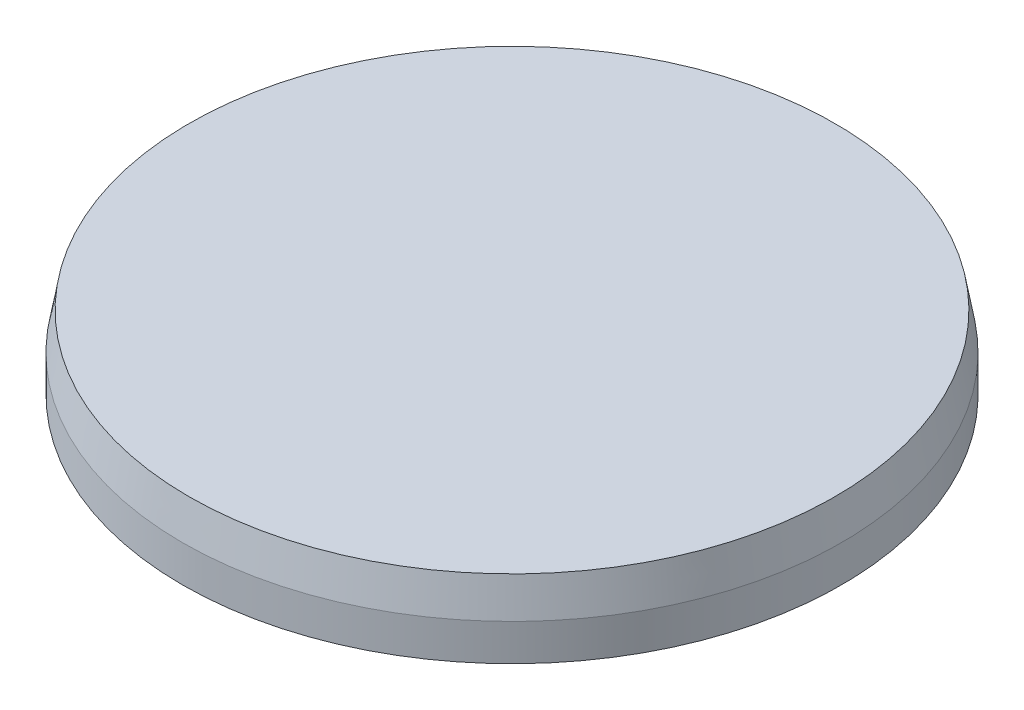
ISO-10303-21;
HEADER;
FILE_DESCRIPTION(('STEP AP214'),'2;1');
FILE_NAME('part.step','',(''),(''),'','','');
FILE_SCHEMA(('AUTOMOTIVE_DESIGN { 1 0 10303 214 1 1 1 1 }'));
ENDSEC;
DATA;
#1=APPLICATION_CONTEXT('core data for automotive mechanical design processes');
#2=APPLICATION_PROTOCOL_DEFINITION('international standard','automotive_design',2000,#1);
#3=PRODUCT_CONTEXT('',#1,'mechanical');
#4=PRODUCT('Part','Part','',(#3));
#5=PRODUCT_RELATED_PRODUCT_CATEGORY('part','',(#4));
#6=PRODUCT_DEFINITION_FORMATION('','',#4);
#7=PRODUCT_DEFINITION_CONTEXT('part definition',#1,'design');
#8=PRODUCT_DEFINITION('design','',#6,#7);
#9=PRODUCT_DEFINITION_SHAPE('','',#8);
#10=(LENGTH_UNIT() NAMED_UNIT(*) SI_UNIT(.MILLI.,.METRE.));
#11=(NAMED_UNIT(*) PLANE_ANGLE_UNIT() SI_UNIT($,.RADIAN.));
#12=(NAMED_UNIT(*) SI_UNIT($,.STERADIAN.) SOLID_ANGLE_UNIT());
#13=UNCERTAINTY_MEASURE_WITH_UNIT(LENGTH_MEASURE(1.E-05),#10,'distance_accuracy_value','');
#14=(GEOMETRIC_REPRESENTATION_CONTEXT(3) GLOBAL_UNCERTAINTY_ASSIGNED_CONTEXT((#13)) GLOBAL_UNIT_ASSIGNED_CONTEXT((#10,
#11,#12)) REPRESENTATION_CONTEXT('',''));
#15=CARTESIAN_POINT('',(0.,0.,0.));
#16=DIRECTION('',(0.,0.,1.));
#17=DIRECTION('',(1.,0.,0.));
#18=AXIS2_PLACEMENT_3D('',#15,#16,#17);
#19=CARTESIAN_POINT('',(0.,2.,0.));
#20=DIRECTION('',(0.,-1.,0.));
#21=DIRECTION('',(0.,0.,-1.));
#22=AXIS2_PLACEMENT_3D('',#19,#20,#21);
#23=CYLINDRICAL_SURFACE('',#22,9.);
#24=CARTESIAN_POINT('',(0.,0.999999999999965,0.));
#25=DIRECTION('',(0.,1.,0.));
#26=DIRECTION('',(0.,0.,1.));
#27=AXIS2_PLACEMENT_3D('',#24,#25,#26);
#28=CIRCLE('',#27,9.);
#29=CARTESIAN_POINT('',(0.,0.999999999999965,9.));
#30=VERTEX_POINT('',#29);
#31=EDGE_CURVE('E10',#30,#30,#28,.F.);
#32=ORIENTED_EDGE('',*,*,#31,.T.);
#33=EDGE_LOOP('',(#32));
#34=FACE_BOUND('',#33,.T.);
#35=CARTESIAN_POINT('',(0.,0.,0.));
#36=DIRECTION('',(0.,1.,0.));
#37=DIRECTION('',(0.,0.,1.));
#38=AXIS2_PLACEMENT_3D('',#35,#36,#37);
#39=CIRCLE('',#38,9.);
#40=CARTESIAN_POINT('',(0.,0.,9.));
#41=VERTEX_POINT('',#40);
#42=EDGE_CURVE('E46',#41,#41,#39,.T.);
#43=ORIENTED_EDGE('',*,*,#42,.T.);
#44=EDGE_LOOP('',(#43));
#45=FACE_BOUND('',#44,.T.);
#46=ADVANCED_FACE('F35',(#34,#45),#23,.T.);
#47=CARTESIAN_POINT('',(0.,2.,0.));
#48=DIRECTION('',(0.,1.,0.));
#49=DIRECTION('',(0.,0.,1.));
#50=AXIS2_PLACEMENT_3D('',#47,#48,#49);
#51=PLANE('',#50);
#52=CARTESIAN_POINT('',(0.,2.,0.));
#53=DIRECTION('',(0.,1.,0.));
#54=DIRECTION('',(0.,0.,1.));
#55=AXIS2_PLACEMENT_3D('',#52,#53,#54);
#56=CIRCLE('',#55,8.82367301929153);
#57=CARTESIAN_POINT('',(0.,2.,8.82367301929153));
#58=VERTEX_POINT('',#57);
#59=EDGE_CURVE('E42',#58,#58,#56,.T.);
#60=ORIENTED_EDGE('',*,*,#59,.T.);
#61=EDGE_LOOP('',(#60));
#62=FACE_BOUND('',#61,.T.);
#63=ADVANCED_FACE('F56',(#62),#51,.T.);
#64=CARTESIAN_POINT('',(0.,0.,0.));
#65=DIRECTION('',(0.,1.,0.));
#66=DIRECTION('',(0.,0.,1.));
#67=AXIS2_PLACEMENT_3D('',#64,#65,#66);
#68=PLANE('',#67);
#69=ORIENTED_EDGE('',*,*,#42,.F.);
#70=EDGE_LOOP('',(#69));
#71=FACE_BOUND('',#70,.T.);
#72=ADVANCED_FACE('F54',(#71),#68,.F.);
#73=CARTESIAN_POINT('',(0.,2.,0.));
#74=DIRECTION('',(0.,-1.,0.));
#75=DIRECTION('',(0.,0.,-1.));
#76=AXIS2_PLACEMENT_3D('',#73,#74,#75);
#77=CONICAL_SURFACE('',#76,8.82367301929153,0.17453292519943);
#78=ORIENTED_EDGE('',*,*,#31,.F.);
#79=EDGE_LOOP('',(#78));
#80=FACE_BOUND('',#79,.T.);
#81=ORIENTED_EDGE('',*,*,#59,.F.);
#82=EDGE_LOOP('',(#81));
#83=FACE_BOUND('',#82,.T.);
#84=ADVANCED_FACE('F37',(#80,#83),#77,.T.);
#85=CLOSED_SHELL('',(#46,#63,#72,#84));
#86=MANIFOLD_SOLID_BREP('B2',#85);
#87=ADVANCED_BREP_SHAPE_REPRESENTATION('',(#18,#86),#14);
#88=SHAPE_DEFINITION_REPRESENTATION(#9,#87);
ENDSEC;
END-ISO-10303-21;
